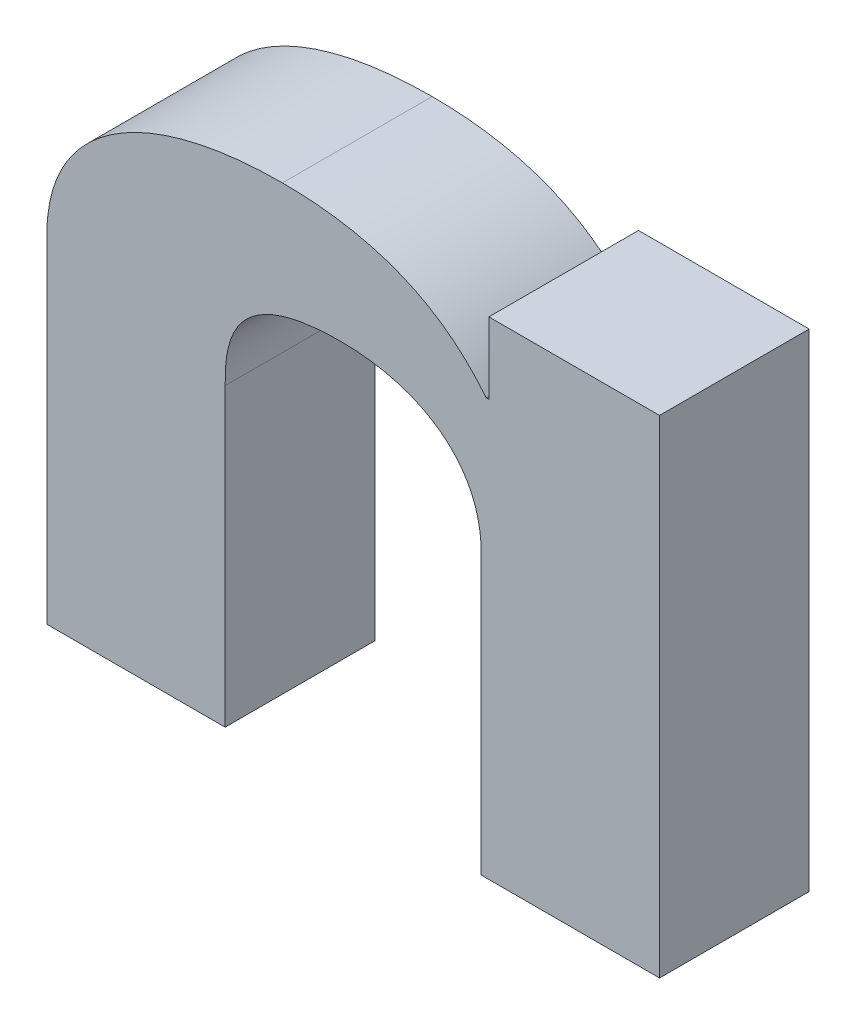
ISO-10303-21;
HEADER;
FILE_DESCRIPTION(('STEP AP214'),'2;1');
FILE_NAME('part.step','',(''),(''),'','','');
FILE_SCHEMA(('AUTOMOTIVE_DESIGN { 1 0 10303 214 1 1 1 1 }'));
ENDSEC;
DATA;
#1=APPLICATION_CONTEXT('core data for automotive mechanical design processes');
#2=APPLICATION_PROTOCOL_DEFINITION('international standard','automotive_design',2000,#1);
#3=PRODUCT_CONTEXT('',#1,'mechanical');
#4=PRODUCT('Part','Part','',(#3));
#5=PRODUCT_RELATED_PRODUCT_CATEGORY('part','',(#4));
#6=PRODUCT_DEFINITION_FORMATION('','',#4);
#7=PRODUCT_DEFINITION_CONTEXT('part definition',#1,'design');
#8=PRODUCT_DEFINITION('design','',#6,#7);
#9=PRODUCT_DEFINITION_SHAPE('','',#8);
#10=(LENGTH_UNIT() NAMED_UNIT(*) SI_UNIT(.MILLI.,.METRE.));
#11=(NAMED_UNIT(*) PLANE_ANGLE_UNIT() SI_UNIT($,.RADIAN.));
#12=(NAMED_UNIT(*) SI_UNIT($,.STERADIAN.) SOLID_ANGLE_UNIT());
#13=UNCERTAINTY_MEASURE_WITH_UNIT(LENGTH_MEASURE(1.E-05),#10,'distance_accuracy_value','');
#14=(GEOMETRIC_REPRESENTATION_CONTEXT(3) GLOBAL_UNCERTAINTY_ASSIGNED_CONTEXT((#13)) GLOBAL_UNIT_ASSIGNED_CONTEXT((#10,
#11,#12)) REPRESENTATION_CONTEXT('',''));
#15=CARTESIAN_POINT('',(0.,0.,0.));
#16=DIRECTION('',(0.,0.,1.));
#17=DIRECTION('',(1.,0.,0.));
#18=AXIS2_PLACEMENT_3D('',#15,#16,#17);
#19=CARTESIAN_POINT('',(-1.005596518538,-0.956235281626,-5.5));
#20=DIRECTION('',(0.,0.,1.));
#21=DIRECTION('',(0.,-1.,0.));
#22=AXIS2_PLACEMENT_3D('',#19,#20,#21);
#23=PLANE('',#22);
#24=DIRECTION('',(1.,0.,0.));
#25=VECTOR('',#24,1.);
#26=CARTESIAN_POINT('',(-3.095666780301,-2.747234350301,-5.5));
#27=LINE('',#26,#25);
#28=CARTESIAN_POINT('',(-3.09566928901934,-2.747234350301,-5.5));
#29=VERTEX_POINT('',#28);
#30=CARTESIAN_POINT('',(-1.904116091412,-2.747234350301,-5.5));
#31=VERTEX_POINT('',#30);
#32=EDGE_CURVE('E287',#29,#31,#27,.T.);
#33=ORIENTED_EDGE('',*,*,#32,.T.);
#34=DIRECTION('',(0.,1.,0.));
#35=VECTOR('',#34,1.);
#36=CARTESIAN_POINT('',(-1.904116091412,-2.747234350301,-5.5));
#37=LINE('',#36,#35);
#38=CARTESIAN_POINT('',(-1.904116091412,-0.770326950301,-5.5));
#39=VERTEX_POINT('',#38);
#40=EDGE_CURVE('E293',#31,#39,#37,.T.);
#41=ORIENTED_EDGE('',*,*,#40,.T.);
#42=CARTESIAN_POINT('',(-1.904116091412,-0.770326950301,-5.5));
#43=CARTESIAN_POINT('',(-1.904116091412,-0.531719350301,-5.5));
#44=CARTESIAN_POINT('',(-1.887284358079,-0.127879105857,-5.5));
#45=CARTESIAN_POINT('',(-1.129458424746,-0.127879105857,-5.5));
#46=(BOUNDED_CURVE() B_SPLINE_CURVE(3,(#42,#43,#44,#45),.UNSPECIFIED.,.F.,
.F.) B_SPLINE_CURVE_WITH_KNOTS((4,4),(0.,1.),
.UNSPECIFIED.) CURVE() GEOMETRIC_REPRESENTATION_ITEM() RATIONAL_B_SPLINE_CURVE((1.,1.,1.,1.)) REPRESENTATION_ITEM(''));
#47=CARTESIAN_POINT('',(-1.129458424746,-0.127879105857,-5.5));
#48=VERTEX_POINT('',#47);
#49=EDGE_CURVE('E230',#39,#48,#46,.T.);
#50=ORIENTED_EDGE('',*,*,#49,.T.);
#51=CARTESIAN_POINT('',(-1.129458424746,-0.127879105857,-5.5));
#52=CARTESIAN_POINT('',(-0.601477091412,-0.127879105857,-5.5));
#53=CARTESIAN_POINT('',(-0.19306766919,-0.384983550301001,-5.5));
#54=CARTESIAN_POINT('',(-0.19306766919,-0.880543194746,-5.5));
#55=(BOUNDED_CURVE() B_SPLINE_CURVE(3,(#51,#52,#53,#54),.UNSPECIFIED.,.F.,
.F.) B_SPLINE_CURVE_WITH_KNOTS((4,4),(0.,1.),
.UNSPECIFIED.) CURVE() GEOMETRIC_REPRESENTATION_ITEM() RATIONAL_B_SPLINE_CURVE((1.,1.,1.,1.)) REPRESENTATION_ITEM(''));
#56=CARTESIAN_POINT('',(-0.19306766919,-0.880543194746,-5.5));
#57=VERTEX_POINT('',#56);
#58=EDGE_CURVE('E239',#48,#57,#55,.T.);
#59=ORIENTED_EDGE('',*,*,#58,.T.);
#60=DIRECTION('',(0.,-1.,0.));
#61=VECTOR('',#60,1.);
#62=CARTESIAN_POINT('',(-0.19306766919,-0.880543194746,-5.5));
#63=LINE('',#62,#61);
#64=CARTESIAN_POINT('',(-0.19306766919,-2.747234350301,-5.5));
#65=VERTEX_POINT('',#64);
#66=EDGE_CURVE('E158',#57,#65,#63,.T.);
#67=ORIENTED_EDGE('',*,*,#66,.T.);
#68=DIRECTION('',(1.,0.,0.));
#69=VECTOR('',#68,1.);
#70=CARTESIAN_POINT('',(-0.19306766919,-2.747234350301,-5.5));
#71=LINE('',#70,#69);
#72=CARTESIAN_POINT('',(0.998672108588,-2.747234350301,-5.5));
#73=VERTEX_POINT('',#72);
#74=EDGE_CURVE('E154',#65,#73,#71,.T.);
#75=ORIENTED_EDGE('',*,*,#74,.T.);
#76=DIRECTION('',(0.,1.,0.));
#77=VECTOR('',#76,1.);
#78=CARTESIAN_POINT('',(0.998672108588,-2.747234350301,-5.5));
#79=LINE('',#78,#77);
#80=CARTESIAN_POINT('',(0.998672108588,0.508721094143,-5.5));
#81=VERTEX_POINT('',#80);
#82=EDGE_CURVE('E141',#73,#81,#79,.T.);
#83=ORIENTED_EDGE('',*,*,#82,.T.);
#84=DIRECTION('',(-1.,0.,0.));
#85=VECTOR('',#84,1.);
#86=CARTESIAN_POINT('',(0.998672108588,0.508721094143,-5.5));
#87=LINE('',#86,#85);
#88=CARTESIAN_POINT('',(-0.141909246968,0.508721094143,-5.5));
#89=VERTEX_POINT('',#88);
#90=EDGE_CURVE('E198',#81,#89,#87,.T.);
#91=ORIENTED_EDGE('',*,*,#90,.T.);
#92=DIRECTION('',(0.,-1.,0.));
#93=VECTOR('',#92,1.);
#94=CARTESIAN_POINT('',(-0.141909246968,0.508721094143,-5.5));
#95=LINE('',#94,#93);
#96=CARTESIAN_POINT('',(-0.141909246968,0.0312942274769999,-5.5));
#97=VERTEX_POINT('',#96);
#98=EDGE_CURVE('E22',#89,#97,#95,.T.);
#99=ORIENTED_EDGE('',*,*,#98,.T.);
#100=DIRECTION('',(-1.,0.,0.));
#101=VECTOR('',#100,1.);
#102=CARTESIAN_POINT('',(-0.141909246968,0.0312942274769999,-5.5));
#103=LINE('',#102,#101);
#104=CARTESIAN_POINT('',(-0.158876446968,0.0312942274769999,-5.5));
#105=VERTEX_POINT('',#104);
#106=EDGE_CURVE('E190',#97,#105,#103,.T.);
#107=ORIENTED_EDGE('',*,*,#106,.T.);
#108=CARTESIAN_POINT('',(-0.158876446968,0.0312942274769999,-5.5));
#109=CARTESIAN_POINT('',(-0.320730891412,0.227139516366,-5.5));
#110=CARTESIAN_POINT('',(-0.661136046968,0.594307805254,-5.5));
#111=CARTESIAN_POINT('',(-1.521024824746,0.594307805254,-5.5));
#112=(BOUNDED_CURVE() B_SPLINE_CURVE(3,(#108,#109,#110,#111),.UNSPECIFIED.,.F.,
.F.) B_SPLINE_CURVE_WITH_KNOTS((4,4),(0.,1.),
.UNSPECIFIED.) CURVE() GEOMETRIC_REPRESENTATION_ITEM() RATIONAL_B_SPLINE_CURVE((1.,1.,1.,1.)) REPRESENTATION_ITEM(''));
#113=CARTESIAN_POINT('',(-1.521024824746,0.594307805254,-5.5));
#114=VERTEX_POINT('',#113);
#115=EDGE_CURVE('E220',#105,#114,#112,.T.);
#116=ORIENTED_EDGE('',*,*,#115,.T.);
#117=CARTESIAN_POINT('',(-1.521024824746,0.594307805254,-5.5));
#118=CARTESIAN_POINT('',(-2.406243046968,0.594307805254,-5.5));
#119=CARTESIAN_POINT('',(-3.095669602523,0.221083027477001,-5.5));
#120=CARTESIAN_POINT('',(-3.095669602523,-0.494968372523,-5.5));
#121=(BOUNDED_CURVE() B_SPLINE_CURVE(3,(#117,#118,#119,#120),.UNSPECIFIED.,.F.,
.F.) B_SPLINE_CURVE_WITH_KNOTS((4,4),(0.,1.),
.UNSPECIFIED.) CURVE() GEOMETRIC_REPRESENTATION_ITEM() RATIONAL_B_SPLINE_CURVE((1.,1.,1.,1.)) REPRESENTATION_ITEM(''));
#122=CARTESIAN_POINT('',(-3.095669602523,-0.494968372523,-5.5));
#123=VERTEX_POINT('',#122);
#124=EDGE_CURVE('E263',#114,#123,#121,.T.);
#125=ORIENTED_EDGE('',*,*,#124,.T.);
#126=DIRECTION('',(0.,-1.,0.));
#127=VECTOR('',#126,1.);
#128=CARTESIAN_POINT('',(-3.095669602523,-0.494968372523,-5.5));
#129=LINE('',#128,#127);
#130=EDGE_CURVE('E11',#123,#29,#129,.T.);
#131=ORIENTED_EDGE('',*,*,#130,.T.);
#132=EDGE_LOOP('',(#33,#41,#50,#59,#67,#75,#83,#91,#99,#107,#116,#125,#131));
#133=FACE_BOUND('',#132,.T.);
#134=ADVANCED_FACE('F16',(#133),#23,.T.);
#135=CARTESIAN_POINT('',(-1.005596518538,-0.956235281626,-6.5));
#136=DIRECTION('',(0.,0.,1.));
#137=DIRECTION('',(0.,-1.,0.));
#138=AXIS2_PLACEMENT_3D('',#135,#136,#137);
#139=PLANE('',#138);
#140=DIRECTION('',(0.,-1.,0.));
#141=VECTOR('',#140,1.);
#142=CARTESIAN_POINT('',(-3.095669602523,-0.494968372523,-6.5));
#143=LINE('',#142,#141);
#144=CARTESIAN_POINT('',(-3.095669602523,-0.494968372523,-6.5));
#145=VERTEX_POINT('',#144);
#146=CARTESIAN_POINT('',(-3.09566928901918,-2.747234350301,-6.5));
#147=VERTEX_POINT('',#146);
#148=EDGE_CURVE('E29',#145,#147,#143,.T.);
#149=ORIENTED_EDGE('',*,*,#148,.F.);
#150=CARTESIAN_POINT('',(-1.521024824746,0.594307805254,-6.5));
#151=CARTESIAN_POINT('',(-2.406243046968,0.594307805254,-6.5));
#152=CARTESIAN_POINT('',(-3.095669602523,0.221083027477001,-6.5));
#153=CARTESIAN_POINT('',(-3.095669602523,-0.494968372523,-6.5));
#154=(BOUNDED_CURVE() B_SPLINE_CURVE(3,(#150,#151,#152,#153),.UNSPECIFIED.,.F.,
.F.) B_SPLINE_CURVE_WITH_KNOTS((4,4),(0.,1.),
.UNSPECIFIED.) CURVE() GEOMETRIC_REPRESENTATION_ITEM() RATIONAL_B_SPLINE_CURVE((1.,1.,1.,1.)) REPRESENTATION_ITEM(''));
#155=CARTESIAN_POINT('',(-1.521024824746,0.594307805254,-6.5));
#156=VERTEX_POINT('',#155);
#157=EDGE_CURVE('E264',#156,#145,#154,.T.);
#158=ORIENTED_EDGE('',*,*,#157,.F.);
#159=CARTESIAN_POINT('',(-0.158876446968,0.0312942274769999,-6.5));
#160=CARTESIAN_POINT('',(-0.320730891412,0.227139516366,-6.5));
#161=CARTESIAN_POINT('',(-0.661136046968,0.594307805254,-6.5));
#162=CARTESIAN_POINT('',(-1.521024824746,0.594307805254,-6.5));
#163=(BOUNDED_CURVE() B_SPLINE_CURVE(3,(#159,#160,#161,#162),.UNSPECIFIED.,.F.,
.F.) B_SPLINE_CURVE_WITH_KNOTS((4,4),(0.,1.),
.UNSPECIFIED.) CURVE() GEOMETRIC_REPRESENTATION_ITEM() RATIONAL_B_SPLINE_CURVE((1.,1.,1.,1.)) REPRESENTATION_ITEM(''));
#164=CARTESIAN_POINT('',(-0.158876446968,0.0312942274769999,-6.5));
#165=VERTEX_POINT('',#164);
#166=EDGE_CURVE('E183',#165,#156,#163,.T.);
#167=ORIENTED_EDGE('',*,*,#166,.F.);
#168=DIRECTION('',(-1.,0.,0.));
#169=VECTOR('',#168,1.);
#170=CARTESIAN_POINT('',(-0.141909246968,0.0312942274769999,-6.5));
#171=LINE('',#170,#169);
#172=CARTESIAN_POINT('',(-0.141909246968,0.0312942274769999,-6.5));
#173=VERTEX_POINT('',#172);
#174=EDGE_CURVE('E179',#173,#165,#171,.T.);
#175=ORIENTED_EDGE('',*,*,#174,.F.);
#176=DIRECTION('',(0.,-1.,0.));
#177=VECTOR('',#176,1.);
#178=CARTESIAN_POINT('',(-0.141909246968,0.508721094143,-6.5));
#179=LINE('',#178,#177);
#180=CARTESIAN_POINT('',(-0.141909246968,0.508721094143,-6.5));
#181=VERTEX_POINT('',#180);
#182=EDGE_CURVE('E213',#181,#173,#179,.T.);
#183=ORIENTED_EDGE('',*,*,#182,.F.);
#184=DIRECTION('',(-1.,0.,0.));
#185=VECTOR('',#184,1.);
#186=CARTESIAN_POINT('',(0.998672108588,0.508721094143,-6.5));
#187=LINE('',#186,#185);
#188=CARTESIAN_POINT('',(0.998672108588,0.508721094143,-6.5));
#189=VERTEX_POINT('',#188);
#190=EDGE_CURVE('E132',#189,#181,#187,.T.);
#191=ORIENTED_EDGE('',*,*,#190,.F.);
#192=DIRECTION('',(0.,1.,0.));
#193=VECTOR('',#192,1.);
#194=CARTESIAN_POINT('',(0.998672108588,-2.747234350301,-6.5));
#195=LINE('',#194,#193);
#196=CARTESIAN_POINT('',(0.998672108588,-2.747234350301,-6.5));
#197=VERTEX_POINT('',#196);
#198=EDGE_CURVE('E163',#197,#189,#195,.T.);
#199=ORIENTED_EDGE('',*,*,#198,.F.);
#200=DIRECTION('',(1.,0.,0.));
#201=VECTOR('',#200,1.);
#202=CARTESIAN_POINT('',(-0.19306766919,-2.747234350301,-6.5));
#203=LINE('',#202,#201);
#204=CARTESIAN_POINT('',(-0.19306766919,-2.747234350301,-6.5));
#205=VERTEX_POINT('',#204);
#206=EDGE_CURVE('E167',#205,#197,#203,.T.);
#207=ORIENTED_EDGE('',*,*,#206,.F.);
#208=DIRECTION('',(0.,-1.,0.));
#209=VECTOR('',#208,1.);
#210=CARTESIAN_POINT('',(-0.19306766919,-0.880543194746,-6.5));
#211=LINE('',#210,#209);
#212=CARTESIAN_POINT('',(-0.19306766919,-0.880543194746,-6.5));
#213=VERTEX_POINT('',#212);
#214=EDGE_CURVE('E202',#213,#205,#211,.T.);
#215=ORIENTED_EDGE('',*,*,#214,.F.);
#216=CARTESIAN_POINT('',(-1.129458424746,-0.127879105857,-6.5));
#217=CARTESIAN_POINT('',(-0.601477091412,-0.127879105857,-6.5));
#218=CARTESIAN_POINT('',(-0.19306766919,-0.384983550301001,-6.5));
#219=CARTESIAN_POINT('',(-0.19306766919,-0.880543194746,-6.5));
#220=(BOUNDED_CURVE() B_SPLINE_CURVE(3,(#216,#217,#218,#219),.UNSPECIFIED.,.F.,
.F.) B_SPLINE_CURVE_WITH_KNOTS((4,4),(0.,1.),
.UNSPECIFIED.) CURVE() GEOMETRIC_REPRESENTATION_ITEM() RATIONAL_B_SPLINE_CURVE((1.,1.,1.,1.)) REPRESENTATION_ITEM(''));
#221=CARTESIAN_POINT('',(-1.129458424746,-0.127879105857,-6.5));
#222=VERTEX_POINT('',#221);
#223=EDGE_CURVE('E225',#222,#213,#220,.T.);
#224=ORIENTED_EDGE('',*,*,#223,.F.);
#225=CARTESIAN_POINT('',(-1.904116091412,-0.770326950301,-6.5));
#226=CARTESIAN_POINT('',(-1.904116091412,-0.531719350301,-6.5));
#227=CARTESIAN_POINT('',(-1.887284358079,-0.127879105857,-6.5));
#228=CARTESIAN_POINT('',(-1.129458424746,-0.127879105857,-6.5));
#229=(BOUNDED_CURVE() B_SPLINE_CURVE(3,(#225,#226,#227,#228),.UNSPECIFIED.,.F.,
.F.) B_SPLINE_CURVE_WITH_KNOTS((4,4),(0.,1.),
.UNSPECIFIED.) CURVE() GEOMETRIC_REPRESENTATION_ITEM() RATIONAL_B_SPLINE_CURVE((1.,1.,1.,1.)) REPRESENTATION_ITEM(''));
#230=CARTESIAN_POINT('',(-1.904116091412,-0.770326950301,-6.5));
#231=VERTEX_POINT('',#230);
#232=EDGE_CURVE('E250',#231,#222,#229,.T.);
#233=ORIENTED_EDGE('',*,*,#232,.F.);
#234=DIRECTION('',(0.,1.,0.));
#235=VECTOR('',#234,1.);
#236=CARTESIAN_POINT('',(-1.904116091412,-2.747234350301,-6.5));
#237=LINE('',#236,#235);
#238=CARTESIAN_POINT('',(-1.904116091412,-2.747234350301,-6.5));
#239=VERTEX_POINT('',#238);
#240=EDGE_CURVE('E256',#239,#231,#237,.T.);
#241=ORIENTED_EDGE('',*,*,#240,.F.);
#242=DIRECTION('',(1.,0.,0.));
#243=VECTOR('',#242,1.);
#244=CARTESIAN_POINT('',(-3.095666780301,-2.747234350301,-6.5));
#245=LINE('',#244,#243);
#246=EDGE_CURVE('E206',#147,#239,#245,.T.);
#247=ORIENTED_EDGE('',*,*,#246,.F.);
#248=EDGE_LOOP('',(#149,#158,#167,#175,#183,#191,#199,#207,#215,#224,#233,#241,#247));
#249=FACE_BOUND('',#248,.T.);
#250=ADVANCED_FACE('F320',(#249),#139,.F.);
#251=CARTESIAN_POINT('',(-3.095669602523,-1.621101361412,-5.49));
#252=DIRECTION('',(1.,0.,0.));
#253=DIRECTION('',(0.,0.,-1.));
#254=AXIS2_PLACEMENT_3D('',#251,#252,#253);
#255=PLANE('',#254);
#256=DIRECTION('',(0.,0.,1.));
#257=VECTOR('',#256,1.);
#258=CARTESIAN_POINT('',(-3.095669602523,-0.494968372523,-6.5));
#259=LINE('',#258,#257);
#260=EDGE_CURVE('E258',#145,#123,#259,.T.);
#261=ORIENTED_EDGE('',*,*,#260,.F.);
#262=ORIENTED_EDGE('',*,*,#148,.T.);
#263=DIRECTION('',(0.,0.,1.));
#264=VECTOR('',#263,1.);
#265=CARTESIAN_POINT('',(-3.095669602523,-2.747234350301,-5.49));
#266=LINE('',#265,#264);
#267=EDGE_CURVE('E203',#147,#29,#266,.T.);
#268=ORIENTED_EDGE('',*,*,#267,.T.);
#269=ORIENTED_EDGE('',*,*,#130,.F.);
#270=EDGE_LOOP('',(#261,#262,#268,#269));
#271=FACE_BOUND('',#270,.T.);
#272=ADVANCED_FACE('F317',(#271),#255,.F.);
#273=CARTESIAN_POINT('',(-1.521024824746,0.594307805254,-5.499));
#274=CARTESIAN_POINT('',(-1.521024824746,0.594307805254,-6.501));
#275=CARTESIAN_POINT('',(-2.406243046968,0.594307805254,-5.499));
#276=CARTESIAN_POINT('',(-2.406243046968,0.594307805254,-6.501));
#277=CARTESIAN_POINT('',(-3.095669602523,0.221083027477001,-5.499));
#278=CARTESIAN_POINT('',(-3.095669602523,0.221083027477001,-6.501));
#279=CARTESIAN_POINT('',(-3.095669602523,-0.494968372523,-5.499));
#280=CARTESIAN_POINT('',(-3.095669602523,-0.494968372523,-6.501));
#281=(BOUNDED_SURFACE() B_SPLINE_SURFACE(3,1,((#273,#274),(#275,#276),(#277,#278),(#279,#280)),
.UNSPECIFIED.,.F.,.F.,.F.) B_SPLINE_SURFACE_WITH_KNOTS((4,4),(2,2),(0.,1.),(-1.001,0.001),
.UNSPECIFIED.) GEOMETRIC_REPRESENTATION_ITEM() RATIONAL_B_SPLINE_SURFACE(((1.,1.),(1.,1.),(1.,
1.),(1.,1.))) REPRESENTATION_ITEM('') SURFACE());
#282=DIRECTION('',(0.,0.,1.));
#283=VECTOR('',#282,1.);
#284=CARTESIAN_POINT('',(-1.521024824746,0.594307805254,-6.5));
#285=LINE('',#284,#283);
#286=EDGE_CURVE('E189',#156,#114,#285,.T.);
#287=ORIENTED_EDGE('',*,*,#286,.F.);
#288=ORIENTED_EDGE('',*,*,#157,.T.);
#289=ORIENTED_EDGE('',*,*,#260,.T.);
#290=ORIENTED_EDGE('',*,*,#124,.F.);
#291=EDGE_LOOP('',(#287,#288,#289,#290));
#292=FACE_BOUND('',#291,.T.);
#293=ADVANCED_FACE('F18',(#292),#281,.F.);
#294=CARTESIAN_POINT('',(-0.158876446968,0.0312942274769999,-5.4986880324536));
#295=CARTESIAN_POINT('',(-0.158876446968,0.0312942274769999,-6.5013119675464));
#296=CARTESIAN_POINT('',(-0.320730891412,0.227139516366,-5.4986880324536));
#297=CARTESIAN_POINT('',(-0.320730891412,0.227139516366,-6.5013119675464));
#298=CARTESIAN_POINT('',(-0.661136046968,0.594307805254,-5.4986880324536));
#299=CARTESIAN_POINT('',(-0.661136046968,0.594307805254,-6.5013119675464));
#300=CARTESIAN_POINT('',(-1.521024824746,0.594307805254,-5.4986880324536));
#301=CARTESIAN_POINT('',(-1.521024824746,0.594307805254,-6.5013119675464));
#302=(BOUNDED_SURFACE() B_SPLINE_SURFACE(3,1,((#294,#295),(#296,#297),(#298,#299),(#300,#301)),
.UNSPECIFIED.,.F.,.F.,.F.) B_SPLINE_SURFACE_WITH_KNOTS((4,4),(2,2),(0.,1.),(-1.0013119675464,
0.00131196754640093),
.UNSPECIFIED.) GEOMETRIC_REPRESENTATION_ITEM() RATIONAL_B_SPLINE_SURFACE(((1.,1.),(1.,1.),(1.,
1.),(1.,1.))) REPRESENTATION_ITEM('') SURFACE());
#303=DIRECTION('',(0.,0.,1.));
#304=VECTOR('',#303,1.);
#305=CARTESIAN_POINT('',(-0.158876446968,0.0312942274769999,-6.5));
#306=LINE('',#305,#304);
#307=EDGE_CURVE('E182',#165,#105,#306,.T.);
#308=ORIENTED_EDGE('',*,*,#307,.F.);
#309=ORIENTED_EDGE('',*,*,#166,.T.);
#310=ORIENTED_EDGE('',*,*,#286,.T.);
#311=ORIENTED_EDGE('',*,*,#115,.F.);
#312=EDGE_LOOP('',(#308,#309,#310,#311));
#313=FACE_BOUND('',#312,.T.);
#314=ADVANCED_FACE('F390',(#313),#302,.F.);
#315=CARTESIAN_POINT('',(-0.150392846968,0.0312942274769999,-5.49));
#316=DIRECTION('',(0.,-1.,0.));
#317=DIRECTION('',(0.,0.,1.));
#318=AXIS2_PLACEMENT_3D('',#315,#316,#317);
#319=PLANE('',#318);
#320=DIRECTION('',(0.,0.,1.));
#321=VECTOR('',#320,1.);
#322=CARTESIAN_POINT('',(-0.141909246968,0.0312942274769999,-6.5));
#323=LINE('',#322,#321);
#324=EDGE_CURVE('E209',#173,#97,#323,.T.);
#325=ORIENTED_EDGE('',*,*,#324,.F.);
#326=ORIENTED_EDGE('',*,*,#174,.T.);
#327=ORIENTED_EDGE('',*,*,#307,.T.);
#328=ORIENTED_EDGE('',*,*,#106,.F.);
#329=EDGE_LOOP('',(#325,#326,#327,#328));
#330=FACE_BOUND('',#329,.T.);
#331=ADVANCED_FACE('F395',(#330),#319,.F.);
#332=CARTESIAN_POINT('',(-0.141909246968,0.27000766081,-5.49));
#333=DIRECTION('',(1.,0.,0.));
#334=DIRECTION('',(0.,0.,-1.));
#335=AXIS2_PLACEMENT_3D('',#332,#333,#334);
#336=PLANE('',#335);
#337=DIRECTION('',(0.,0.,1.));
#338=VECTOR('',#337,1.);
#339=CARTESIAN_POINT('',(-0.141909246968,0.508721094143,-6.5));
#340=LINE('',#339,#338);
#341=EDGE_CURVE('E191',#181,#89,#340,.T.);
#342=ORIENTED_EDGE('',*,*,#341,.F.);
#343=ORIENTED_EDGE('',*,*,#182,.T.);
#344=ORIENTED_EDGE('',*,*,#324,.T.);
#345=ORIENTED_EDGE('',*,*,#98,.F.);
#346=EDGE_LOOP('',(#342,#343,#344,#345));
#347=FACE_BOUND('',#346,.T.);
#348=ADVANCED_FACE('F405',(#347),#336,.F.);
#349=CARTESIAN_POINT('',(0.42838143081,0.508721094143,-5.49));
#350=DIRECTION('',(0.,-1.,0.));
#351=DIRECTION('',(0.,0.,1.));
#352=AXIS2_PLACEMENT_3D('',#349,#350,#351);
#353=PLANE('',#352);
#354=DIRECTION('',(0.,0.,1.));
#355=VECTOR('',#354,1.);
#356=CARTESIAN_POINT('',(0.998672108588,0.508721094143,-6.5));
#357=LINE('',#356,#355);
#358=EDGE_CURVE('E148',#189,#81,#357,.T.);
#359=ORIENTED_EDGE('',*,*,#358,.F.);
#360=ORIENTED_EDGE('',*,*,#190,.T.);
#361=ORIENTED_EDGE('',*,*,#341,.T.);
#362=ORIENTED_EDGE('',*,*,#90,.F.);
#363=EDGE_LOOP('',(#359,#360,#361,#362));
#364=FACE_BOUND('',#363,.T.);
#365=ADVANCED_FACE('F403',(#364),#353,.F.);
#366=CARTESIAN_POINT('',(0.998672108588,-1.119256628079,-5.49));
#367=DIRECTION('',(-1.,0.,0.));
#368=DIRECTION('',(0.,1.,0.));
#369=AXIS2_PLACEMENT_3D('',#366,#367,#368);
#370=PLANE('',#369);
#371=DIRECTION('',(0.,0.,1.));
#372=VECTOR('',#371,1.);
#373=CARTESIAN_POINT('',(0.998672108588,-2.747234350301,-6.5));
#374=LINE('',#373,#372);
#375=EDGE_CURVE('E146',#197,#73,#374,.T.);
#376=ORIENTED_EDGE('',*,*,#375,.F.);
#377=ORIENTED_EDGE('',*,*,#198,.T.);
#378=ORIENTED_EDGE('',*,*,#358,.T.);
#379=ORIENTED_EDGE('',*,*,#82,.F.);
#380=EDGE_LOOP('',(#376,#377,#378,#379));
#381=FACE_BOUND('',#380,.T.);
#382=ADVANCED_FACE('F143',(#381),#370,.F.);
#383=CARTESIAN_POINT('',(0.402802219699,-2.747234350301,-5.49));
#384=DIRECTION('',(0.,1.,0.));
#385=DIRECTION('',(-1.,0.,0.));
#386=AXIS2_PLACEMENT_3D('',#383,#384,#385);
#387=PLANE('',#386);
#388=DIRECTION('',(0.,0.,1.));
#389=VECTOR('',#388,1.);
#390=CARTESIAN_POINT('',(-0.19306766919,-2.747234350301,-6.5));
#391=LINE('',#390,#389);
#392=EDGE_CURVE('E199',#205,#65,#391,.T.);
#393=ORIENTED_EDGE('',*,*,#392,.F.);
#394=ORIENTED_EDGE('',*,*,#206,.T.);
#395=ORIENTED_EDGE('',*,*,#375,.T.);
#396=ORIENTED_EDGE('',*,*,#74,.F.);
#397=EDGE_LOOP('',(#393,#394,#395,#396));
#398=FACE_BOUND('',#397,.T.);
#399=ADVANCED_FACE('F165',(#398),#387,.F.);
#400=CARTESIAN_POINT('',(-0.19306766919,-1.8138887725235,-5.49));
#401=DIRECTION('',(1.,0.,0.));
#402=DIRECTION('',(0.,0.,-1.));
#403=AXIS2_PLACEMENT_3D('',#400,#401,#402);
#404=PLANE('',#403);
#405=DIRECTION('',(0.,0.,1.));
#406=VECTOR('',#405,1.);
#407=CARTESIAN_POINT('',(-0.19306766919,-0.880543194746,-6.5));
#408=LINE('',#407,#406);
#409=EDGE_CURVE('E177',#213,#57,#408,.T.);
#410=ORIENTED_EDGE('',*,*,#409,.F.);
#411=ORIENTED_EDGE('',*,*,#214,.T.);
#412=ORIENTED_EDGE('',*,*,#392,.T.);
#413=ORIENTED_EDGE('',*,*,#66,.F.);
#414=EDGE_LOOP('',(#410,#411,#412,#413));
#415=FACE_BOUND('',#414,.T.);
#416=ADVANCED_FACE('F341',(#415),#404,.F.);
#417=CARTESIAN_POINT('',(-1.129458424746,-0.127879105857,-5.499));
#418=CARTESIAN_POINT('',(-1.129458424746,-0.127879105857,-6.501));
#419=CARTESIAN_POINT('',(-0.601477091412,-0.127879105857,-5.499));
#420=CARTESIAN_POINT('',(-0.601477091412,-0.127879105857,-6.501));
#421=CARTESIAN_POINT('',(-0.19306766919,-0.384983550301001,-5.499));
#422=CARTESIAN_POINT('',(-0.19306766919,-0.384983550301001,-6.501));
#423=CARTESIAN_POINT('',(-0.19306766919,-0.880543194746,-5.499));
#424=CARTESIAN_POINT('',(-0.19306766919,-0.880543194746,-6.501));
#425=(BOUNDED_SURFACE() B_SPLINE_SURFACE(3,1,((#417,#418),(#419,#420),(#421,#422),(#423,#424)),
.UNSPECIFIED.,.F.,.F.,.F.) B_SPLINE_SURFACE_WITH_KNOTS((4,4),(2,2),(0.,1.),(-1.001,0.001),
.UNSPECIFIED.) GEOMETRIC_REPRESENTATION_ITEM() RATIONAL_B_SPLINE_SURFACE(((1.,1.),(1.,1.),(1.,
1.),(1.,1.))) REPRESENTATION_ITEM('') SURFACE());
#426=DIRECTION('',(0.,0.,1.));
#427=VECTOR('',#426,1.);
#428=CARTESIAN_POINT('',(-1.129458424746,-0.127879105857,-6.5));
#429=LINE('',#428,#427);
#430=EDGE_CURVE('E242',#222,#48,#429,.T.);
#431=ORIENTED_EDGE('',*,*,#430,.F.);
#432=ORIENTED_EDGE('',*,*,#223,.T.);
#433=ORIENTED_EDGE('',*,*,#409,.T.);
#434=ORIENTED_EDGE('',*,*,#58,.F.);
#435=EDGE_LOOP('',(#431,#432,#433,#434));
#436=FACE_BOUND('',#435,.T.);
#437=ADVANCED_FACE('F372',(#436),#425,.F.);
#438=CARTESIAN_POINT('',(-1.904116091412,-0.770326950301,-5.49860300621886));
#439=CARTESIAN_POINT('',(-1.904116091412,-0.770326950301,-6.50139699378114));
#440=CARTESIAN_POINT('',(-1.904116091412,-0.531719350301,-5.49860300621886));
#441=CARTESIAN_POINT('',(-1.904116091412,-0.531719350301,-6.50139699378114));
#442=CARTESIAN_POINT('',(-1.887284358079,-0.127879105857,-5.49860300621886));
#443=CARTESIAN_POINT('',(-1.887284358079,-0.127879105857,-6.50139699378114));
#444=CARTESIAN_POINT('',(-1.129458424746,-0.127879105857,-5.49860300621886));
#445=CARTESIAN_POINT('',(-1.129458424746,-0.127879105857,-6.50139699378114));
#446=(BOUNDED_SURFACE() B_SPLINE_SURFACE(3,1,((#438,#439),(#440,#441),(#442,#443),(#444,#445)),
.UNSPECIFIED.,.F.,.F.,.F.) B_SPLINE_SURFACE_WITH_KNOTS((4,4),(2,2),(0.,1.),(-1.00139699378114,
0.00139699378114248),
.UNSPECIFIED.) GEOMETRIC_REPRESENTATION_ITEM() RATIONAL_B_SPLINE_SURFACE(((1.,1.),(1.,1.),(1.,
1.),(1.,1.))) REPRESENTATION_ITEM('') SURFACE());
#447=DIRECTION('',(0.,0.,1.));
#448=VECTOR('',#447,1.);
#449=CARTESIAN_POINT('',(-1.904116091412,-0.770326950301,-6.5));
#450=LINE('',#449,#448);
#451=EDGE_CURVE('E296',#231,#39,#450,.T.);
#452=ORIENTED_EDGE('',*,*,#451,.F.);
#453=ORIENTED_EDGE('',*,*,#232,.T.);
#454=ORIENTED_EDGE('',*,*,#430,.T.);
#455=ORIENTED_EDGE('',*,*,#49,.F.);
#456=EDGE_LOOP('',(#452,#453,#454,#455));
#457=FACE_BOUND('',#456,.T.);
#458=ADVANCED_FACE('F364',(#457),#446,.F.);
#459=CARTESIAN_POINT('',(-1.904116091412,-1.758780650301,-5.49));
#460=DIRECTION('',(-1.,0.,0.));
#461=DIRECTION('',(0.,1.,0.));
#462=AXIS2_PLACEMENT_3D('',#459,#460,#461);
#463=PLANE('',#462);
#464=DIRECTION('',(0.,0.,1.));
#465=VECTOR('',#464,1.);
#466=CARTESIAN_POINT('',(-1.904116091412,-2.747234350301,-6.5));
#467=LINE('',#466,#465);
#468=EDGE_CURVE('E292',#239,#31,#467,.T.);
#469=ORIENTED_EDGE('',*,*,#468,.F.);
#470=ORIENTED_EDGE('',*,*,#240,.T.);
#471=ORIENTED_EDGE('',*,*,#451,.T.);
#472=ORIENTED_EDGE('',*,*,#40,.F.);
#473=EDGE_LOOP('',(#469,#470,#471,#472));
#474=FACE_BOUND('',#473,.T.);
#475=ADVANCED_FACE('F362',(#474),#463,.F.);
#476=CARTESIAN_POINT('',(-2.4998914358565,-2.747234350301,-5.49));
#477=DIRECTION('',(0.,1.,0.));
#478=DIRECTION('',(-1.,0.,0.));
#479=AXIS2_PLACEMENT_3D('',#476,#477,#478);
#480=PLANE('',#479);
#481=ORIENTED_EDGE('',*,*,#267,.F.);
#482=ORIENTED_EDGE('',*,*,#246,.T.);
#483=ORIENTED_EDGE('',*,*,#468,.T.);
#484=ORIENTED_EDGE('',*,*,#32,.F.);
#485=EDGE_LOOP('',(#481,#482,#483,#484));
#486=FACE_BOUND('',#485,.T.);
#487=ADVANCED_FACE('F327',(#486),#480,.F.);
#488=CLOSED_SHELL('',(#134,#250,#272,#293,#314,#331,#348,#365,#382,#399,#416,#437,#458,#475,#487));
#489=MANIFOLD_SOLID_BREP('B1',#488);
#490=ADVANCED_BREP_SHAPE_REPRESENTATION('',(#18,#489),#14);
#491=SHAPE_DEFINITION_REPRESENTATION(#9,#490);
ENDSEC;
END-ISO-10303-21;
